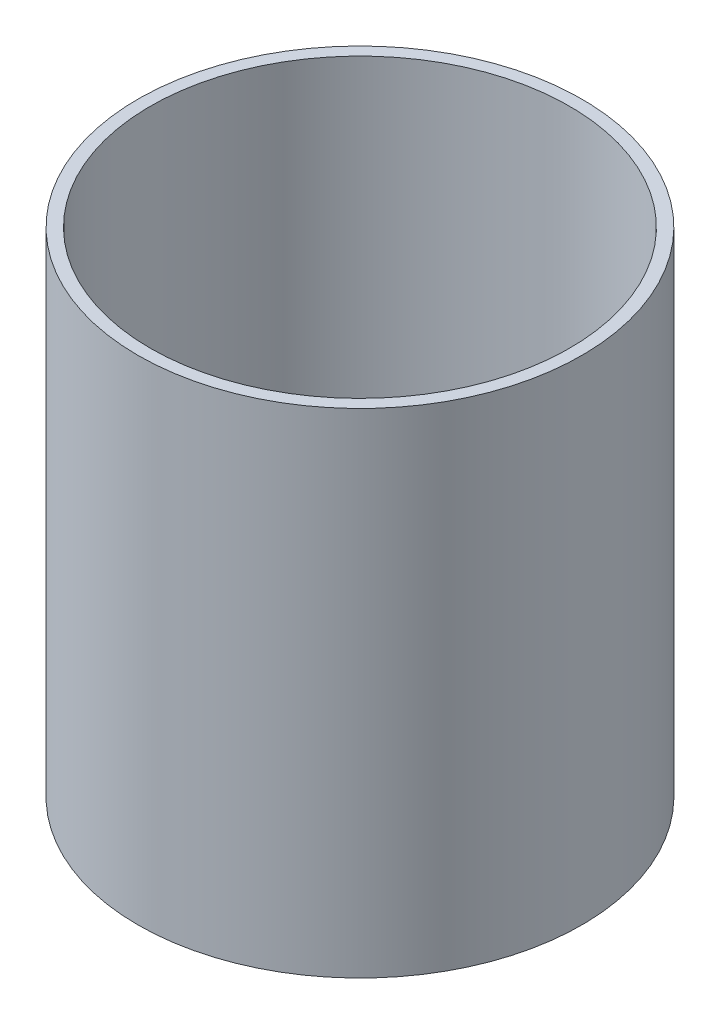
ISO-10303-21;
HEADER;
FILE_DESCRIPTION(('STEP AP214'),'2;1');
FILE_NAME('part.step','',(''),(''),'','','');
FILE_SCHEMA(('AUTOMOTIVE_DESIGN { 1 0 10303 214 1 1 1 1 }'));
ENDSEC;
DATA;
#1=APPLICATION_CONTEXT('core data for automotive mechanical design processes');
#2=APPLICATION_PROTOCOL_DEFINITION('international standard','automotive_design',2000,#1);
#3=PRODUCT_CONTEXT('',#1,'mechanical');
#4=PRODUCT('Part','Part','',(#3));
#5=PRODUCT_RELATED_PRODUCT_CATEGORY('part','',(#4));
#6=PRODUCT_DEFINITION_FORMATION('','',#4);
#7=PRODUCT_DEFINITION_CONTEXT('part definition',#1,'design');
#8=PRODUCT_DEFINITION('design','',#6,#7);
#9=PRODUCT_DEFINITION_SHAPE('','',#8);
#10=(LENGTH_UNIT() NAMED_UNIT(*) SI_UNIT(.MILLI.,.METRE.));
#11=(NAMED_UNIT(*) PLANE_ANGLE_UNIT() SI_UNIT($,.RADIAN.));
#12=(NAMED_UNIT(*) SI_UNIT($,.STERADIAN.) SOLID_ANGLE_UNIT());
#13=UNCERTAINTY_MEASURE_WITH_UNIT(LENGTH_MEASURE(1.E-05),#10,'distance_accuracy_value','');
#14=(GEOMETRIC_REPRESENTATION_CONTEXT(3) GLOBAL_UNCERTAINTY_ASSIGNED_CONTEXT((#13)) GLOBAL_UNIT_ASSIGNED_CONTEXT((#10,
#11,#12)) REPRESENTATION_CONTEXT('',''));
#15=CARTESIAN_POINT('',(0.,0.,0.));
#16=DIRECTION('',(0.,0.,1.));
#17=DIRECTION('',(1.,0.,0.));
#18=AXIS2_PLACEMENT_3D('',#15,#16,#17);
#19=CARTESIAN_POINT('',(0.,50.,0.));
#20=DIRECTION('',(0.,1.,0.));
#21=DIRECTION('',(0.,0.,1.));
#22=AXIS2_PLACEMENT_3D('',#19,#20,#21);
#23=PLANE('',#22);
#24=CARTESIAN_POINT('',(0.,50.,0.));
#25=DIRECTION('',(0.,1.,0.));
#26=DIRECTION('',(0.,0.,1.));
#27=AXIS2_PLACEMENT_3D('',#24,#25,#26);
#28=CIRCLE('',#27,22.5);
#29=CARTESIAN_POINT('',(0.,50.,22.5));
#30=VERTEX_POINT('',#29);
#31=EDGE_CURVE('E10',#30,#30,#28,.T.);
#32=ORIENTED_EDGE('',*,*,#31,.T.);
#33=EDGE_LOOP('',(#32));
#34=FACE_BOUND('',#33,.T.);
#35=CARTESIAN_POINT('',(0.,50.,0.));
#36=DIRECTION('',(0.,1.,0.));
#37=DIRECTION('',(0.,0.,1.));
#38=AXIS2_PLACEMENT_3D('',#35,#36,#37);
#39=CIRCLE('',#38,21.25);
#40=CARTESIAN_POINT('',(0.,50.,21.25));
#41=VERTEX_POINT('',#40);
#42=EDGE_CURVE('E57',#41,#41,#39,.T.);
#43=ORIENTED_EDGE('',*,*,#42,.F.);
#44=EDGE_LOOP('',(#43));
#45=FACE_BOUND('',#44,.T.);
#46=ADVANCED_FACE('F43',(#34,#45),#23,.T.);
#47=CARTESIAN_POINT('',(0.,0.,0.));
#48=DIRECTION('',(0.,1.,0.));
#49=DIRECTION('',(0.,0.,1.));
#50=AXIS2_PLACEMENT_3D('',#47,#48,#49);
#51=PLANE('',#50);
#52=CARTESIAN_POINT('',(0.,0.,0.));
#53=DIRECTION('',(0.,1.,0.));
#54=DIRECTION('',(0.,0.,1.));
#55=AXIS2_PLACEMENT_3D('',#52,#53,#54);
#56=CIRCLE('',#55,22.5);
#57=CARTESIAN_POINT('',(0.,0.,22.5));
#58=VERTEX_POINT('',#57);
#59=EDGE_CURVE('E50',#58,#58,#56,.T.);
#60=ORIENTED_EDGE('',*,*,#59,.F.);
#61=EDGE_LOOP('',(#60));
#62=FACE_BOUND('',#61,.T.);
#63=CARTESIAN_POINT('',(0.,0.,0.));
#64=DIRECTION('',(0.,1.,0.));
#65=DIRECTION('',(0.,0.,1.));
#66=AXIS2_PLACEMENT_3D('',#63,#64,#65);
#67=CIRCLE('',#66,21.25);
#68=CARTESIAN_POINT('',(0.,0.,21.25));
#69=VERTEX_POINT('',#68);
#70=EDGE_CURVE('E59',#69,#69,#67,.T.);
#71=ORIENTED_EDGE('',*,*,#70,.T.);
#72=EDGE_LOOP('',(#71));
#73=FACE_BOUND('',#72,.T.);
#74=ADVANCED_FACE('F68',(#62,#73),#51,.F.);
#75=CARTESIAN_POINT('',(0.,50.,0.));
#76=DIRECTION('',(0.,-1.,0.));
#77=DIRECTION('',(0.,0.,-1.));
#78=AXIS2_PLACEMENT_3D('',#75,#76,#77);
#79=CYLINDRICAL_SURFACE('',#78,22.5);
#80=ORIENTED_EDGE('',*,*,#31,.F.);
#81=EDGE_LOOP('',(#80));
#82=FACE_BOUND('',#81,.T.);
#83=ORIENTED_EDGE('',*,*,#59,.T.);
#84=EDGE_LOOP('',(#83));
#85=FACE_BOUND('',#84,.T.);
#86=ADVANCED_FACE('F44',(#82,#85),#79,.T.);
#87=CARTESIAN_POINT('',(0.,50.,0.));
#88=DIRECTION('',(0.,-1.,0.));
#89=DIRECTION('',(0.,0.,-1.));
#90=AXIS2_PLACEMENT_3D('',#87,#88,#89);
#91=CYLINDRICAL_SURFACE('',#90,21.25);
#92=ORIENTED_EDGE('',*,*,#42,.T.);
#93=EDGE_LOOP('',(#92));
#94=FACE_BOUND('',#93,.T.);
#95=ORIENTED_EDGE('',*,*,#70,.F.);
#96=EDGE_LOOP('',(#95));
#97=FACE_BOUND('',#96,.T.);
#98=ADVANCED_FACE('F67',(#94,#97),#91,.F.);
#99=CLOSED_SHELL('',(#46,#74,#86,#98));
#100=MANIFOLD_SOLID_BREP('B2',#99);
#101=ADVANCED_BREP_SHAPE_REPRESENTATION('',(#18,#100),#14);
#102=SHAPE_DEFINITION_REPRESENTATION(#9,#101);
ENDSEC;
END-ISO-10303-21;
